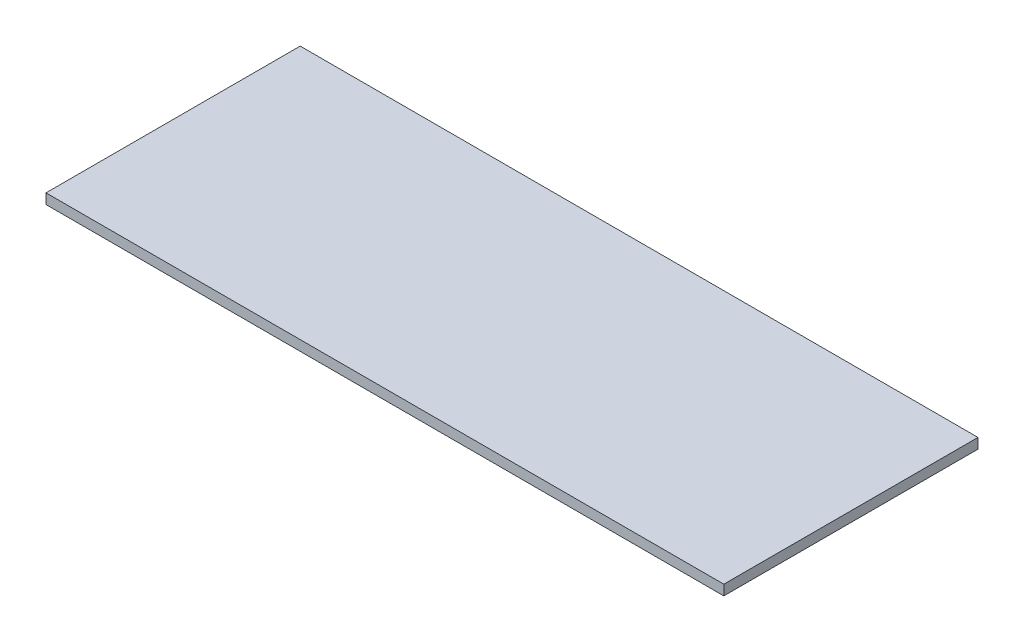
ISO-10303-21;
HEADER;
FILE_DESCRIPTION(('STEP AP214'),'2;1');
FILE_NAME('part.step','',(''),(''),'','','');
FILE_SCHEMA(('AUTOMOTIVE_DESIGN { 1 0 10303 214 1 1 1 1 }'));
ENDSEC;
DATA;
#1=APPLICATION_CONTEXT('core data for automotive mechanical design processes');
#2=APPLICATION_PROTOCOL_DEFINITION('international standard','automotive_design',2000,#1);
#3=PRODUCT_CONTEXT('',#1,'mechanical');
#4=PRODUCT('Part','Part','',(#3));
#5=PRODUCT_RELATED_PRODUCT_CATEGORY('part','',(#4));
#6=PRODUCT_DEFINITION_FORMATION('','',#4);
#7=PRODUCT_DEFINITION_CONTEXT('part definition',#1,'design');
#8=PRODUCT_DEFINITION('design','',#6,#7);
#9=PRODUCT_DEFINITION_SHAPE('','',#8);
#10=(LENGTH_UNIT() NAMED_UNIT(*) SI_UNIT(.MILLI.,.METRE.));
#11=(NAMED_UNIT(*) PLANE_ANGLE_UNIT() SI_UNIT($,.RADIAN.));
#12=(NAMED_UNIT(*) SI_UNIT($,.STERADIAN.) SOLID_ANGLE_UNIT());
#13=UNCERTAINTY_MEASURE_WITH_UNIT(LENGTH_MEASURE(1.E-05),#10,'distance_accuracy_value','');
#14=(GEOMETRIC_REPRESENTATION_CONTEXT(3) GLOBAL_UNCERTAINTY_ASSIGNED_CONTEXT((#13)) GLOBAL_UNIT_ASSIGNED_CONTEXT((#10,
#11,#12)) REPRESENTATION_CONTEXT('',''));
#15=CARTESIAN_POINT('',(0.,0.,0.));
#16=DIRECTION('',(0.,0.,1.));
#17=DIRECTION('',(1.,0.,0.));
#18=AXIS2_PLACEMENT_3D('',#15,#16,#17);
#19=CARTESIAN_POINT('',(100.,3.,37.5));
#20=DIRECTION('',(-1.,0.,0.));
#21=DIRECTION('',(0.,0.,1.));
#22=AXIS2_PLACEMENT_3D('',#19,#20,#21);
#23=PLANE('',#22);
#24=DIRECTION('',(0.,0.,-1.));
#25=VECTOR('',#24,1.);
#26=CARTESIAN_POINT('',(100.,0.,37.5));
#27=LINE('',#26,#25);
#28=CARTESIAN_POINT('',(100.,0.,37.5));
#29=VERTEX_POINT('',#28);
#30=CARTESIAN_POINT('',(100.,0.,-37.5));
#31=VERTEX_POINT('',#30);
#32=EDGE_CURVE('E113',#29,#31,#27,.T.);
#33=ORIENTED_EDGE('',*,*,#32,.T.);
#34=DIRECTION('',(0.,-1.,0.));
#35=VECTOR('',#34,1.);
#36=CARTESIAN_POINT('',(100.,3.,-37.5));
#37=LINE('',#36,#35);
#38=CARTESIAN_POINT('',(100.,3.,-37.5));
#39=VERTEX_POINT('',#38);
#40=EDGE_CURVE('E11',#39,#31,#37,.T.);
#41=ORIENTED_EDGE('',*,*,#40,.F.);
#42=DIRECTION('',(0.,0.,-1.));
#43=VECTOR('',#42,1.);
#44=CARTESIAN_POINT('',(100.,3.,37.5));
#45=LINE('',#44,#43);
#46=CARTESIAN_POINT('',(100.,3.,37.5));
#47=VERTEX_POINT('',#46);
#48=EDGE_CURVE('E97',#47,#39,#45,.T.);
#49=ORIENTED_EDGE('',*,*,#48,.F.);
#50=DIRECTION('',(0.,-1.,0.));
#51=VECTOR('',#50,1.);
#52=CARTESIAN_POINT('',(100.,3.,37.5));
#53=LINE('',#52,#51);
#54=EDGE_CURVE('E109',#47,#29,#53,.T.);
#55=ORIENTED_EDGE('',*,*,#54,.T.);
#56=EDGE_LOOP('',(#33,#41,#49,#55));
#57=FACE_BOUND('',#56,.T.);
#58=ADVANCED_FACE('F45',(#57),#23,.F.);
#59=CARTESIAN_POINT('',(-100.,3.,-37.5));
#60=DIRECTION('',(0.,0.,1.));
#61=DIRECTION('',(1.,0.,0.));
#62=AXIS2_PLACEMENT_3D('',#59,#60,#61);
#63=PLANE('',#62);
#64=DIRECTION('',(-1.,0.,0.));
#65=VECTOR('',#64,1.);
#66=CARTESIAN_POINT('',(-100.,0.,-37.5));
#67=LINE('',#66,#65);
#68=CARTESIAN_POINT('',(-100.,0.,-37.5));
#69=VERTEX_POINT('',#68);
#70=EDGE_CURVE('E102',#31,#69,#67,.T.);
#71=ORIENTED_EDGE('',*,*,#70,.T.);
#72=DIRECTION('',(0.,-1.,0.));
#73=VECTOR('',#72,1.);
#74=CARTESIAN_POINT('',(-100.,3.,-37.5));
#75=LINE('',#74,#73);
#76=CARTESIAN_POINT('',(-100.,3.,-37.5));
#77=VERTEX_POINT('',#76);
#78=EDGE_CURVE('E54',#77,#69,#75,.T.);
#79=ORIENTED_EDGE('',*,*,#78,.F.);
#80=DIRECTION('',(-1.,0.,0.));
#81=VECTOR('',#80,1.);
#82=CARTESIAN_POINT('',(-100.,3.,-37.5));
#83=LINE('',#82,#81);
#84=EDGE_CURVE('E92',#39,#77,#83,.T.);
#85=ORIENTED_EDGE('',*,*,#84,.F.);
#86=ORIENTED_EDGE('',*,*,#40,.T.);
#87=EDGE_LOOP('',(#71,#79,#85,#86));
#88=FACE_BOUND('',#87,.T.);
#89=ADVANCED_FACE('F101',(#88),#63,.F.);
#90=CARTESIAN_POINT('',(-100.,3.,37.5));
#91=DIRECTION('',(1.,0.,0.));
#92=DIRECTION('',(0.,0.,-1.));
#93=AXIS2_PLACEMENT_3D('',#90,#91,#92);
#94=PLANE('',#93);
#95=DIRECTION('',(0.,0.,1.));
#96=VECTOR('',#95,1.);
#97=CARTESIAN_POINT('',(-100.,0.,37.5));
#98=LINE('',#97,#96);
#99=CARTESIAN_POINT('',(-100.,0.,37.5));
#100=VERTEX_POINT('',#99);
#101=EDGE_CURVE('E79',#69,#100,#98,.T.);
#102=ORIENTED_EDGE('',*,*,#101,.T.);
#103=DIRECTION('',(0.,-1.,0.));
#104=VECTOR('',#103,1.);
#105=CARTESIAN_POINT('',(-100.,3.,37.5));
#106=LINE('',#105,#104);
#107=CARTESIAN_POINT('',(-100.,3.,37.5));
#108=VERTEX_POINT('',#107);
#109=EDGE_CURVE('E104',#108,#100,#106,.T.);
#110=ORIENTED_EDGE('',*,*,#109,.F.);
#111=DIRECTION('',(0.,0.,1.));
#112=VECTOR('',#111,1.);
#113=CARTESIAN_POINT('',(-100.,3.,37.5));
#114=LINE('',#113,#112);
#115=EDGE_CURVE('E95',#77,#108,#114,.T.);
#116=ORIENTED_EDGE('',*,*,#115,.F.);
#117=ORIENTED_EDGE('',*,*,#78,.T.);
#118=EDGE_LOOP('',(#102,#110,#116,#117));
#119=FACE_BOUND('',#118,.T.);
#120=ADVANCED_FACE('F105',(#119),#94,.F.);
#121=CARTESIAN_POINT('',(-100.,3.,37.5));
#122=DIRECTION('',(0.,0.,-1.));
#123=DIRECTION('',(-1.,0.,0.));
#124=AXIS2_PLACEMENT_3D('',#121,#122,#123);
#125=PLANE('',#124);
#126=DIRECTION('',(1.,0.,0.));
#127=VECTOR('',#126,1.);
#128=CARTESIAN_POINT('',(-100.,0.,37.5));
#129=LINE('',#128,#127);
#130=EDGE_CURVE('E85',#100,#29,#129,.T.);
#131=ORIENTED_EDGE('',*,*,#130,.T.);
#132=ORIENTED_EDGE('',*,*,#54,.F.);
#133=DIRECTION('',(1.,0.,0.));
#134=VECTOR('',#133,1.);
#135=CARTESIAN_POINT('',(-100.,3.,37.5));
#136=LINE('',#135,#134);
#137=EDGE_CURVE('E62',#108,#47,#136,.T.);
#138=ORIENTED_EDGE('',*,*,#137,.F.);
#139=ORIENTED_EDGE('',*,*,#109,.T.);
#140=EDGE_LOOP('',(#131,#132,#138,#139));
#141=FACE_BOUND('',#140,.T.);
#142=ADVANCED_FACE('F126',(#141),#125,.F.);
#143=CARTESIAN_POINT('',(0.,3.,0.));
#144=DIRECTION('',(0.,-1.,0.));
#145=DIRECTION('',(0.,0.,-1.));
#146=AXIS2_PLACEMENT_3D('',#143,#144,#145);
#147=PLANE('',#146);
#148=ORIENTED_EDGE('',*,*,#48,.T.);
#149=ORIENTED_EDGE('',*,*,#84,.T.);
#150=ORIENTED_EDGE('',*,*,#115,.T.);
#151=ORIENTED_EDGE('',*,*,#137,.T.);
#152=EDGE_LOOP('',(#148,#149,#150,#151));
#153=FACE_BOUND('',#152,.T.);
#154=ADVANCED_FACE('F93',(#153),#147,.F.);
#155=CARTESIAN_POINT('',(0.,0.,0.));
#156=DIRECTION('',(0.,-1.,0.));
#157=DIRECTION('',(0.,0.,-1.));
#158=AXIS2_PLACEMENT_3D('',#155,#156,#157);
#159=PLANE('',#158);
#160=ORIENTED_EDGE('',*,*,#32,.F.);
#161=ORIENTED_EDGE('',*,*,#130,.F.);
#162=ORIENTED_EDGE('',*,*,#101,.F.);
#163=ORIENTED_EDGE('',*,*,#70,.F.);
#164=EDGE_LOOP('',(#160,#161,#162,#163));
#165=FACE_BOUND('',#164,.T.);
#166=ADVANCED_FACE('F129',(#165),#159,.T.);
#167=CLOSED_SHELL('',(#58,#89,#120,#142,#154,#166));
#168=MANIFOLD_SOLID_BREP('B2',#167);
#169=ADVANCED_BREP_SHAPE_REPRESENTATION('',(#18,#168),#14);
#170=SHAPE_DEFINITION_REPRESENTATION(#9,#169);
ENDSEC;
END-ISO-10303-21;
